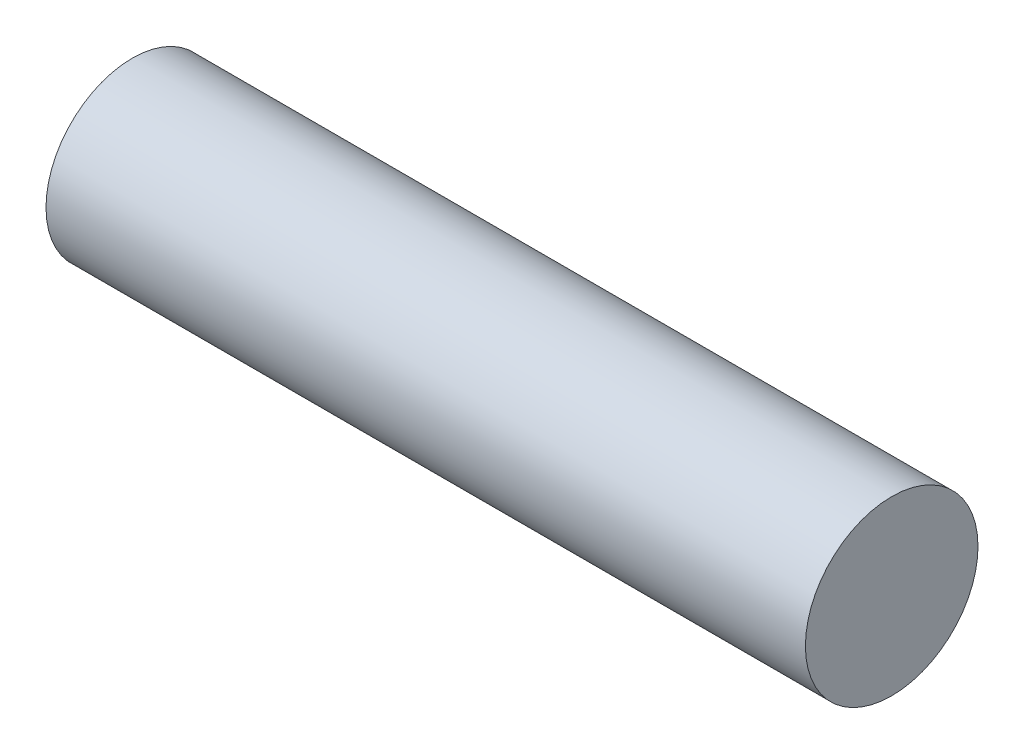
ISO-10303-21;
HEADER;
FILE_DESCRIPTION(('STEP AP214'),'2;1');
FILE_NAME('part.step','',(''),(''),'','','');
FILE_SCHEMA(('AUTOMOTIVE_DESIGN { 1 0 10303 214 1 1 1 1 }'));
ENDSEC;
DATA;
#1=APPLICATION_CONTEXT('core data for automotive mechanical design processes');
#2=APPLICATION_PROTOCOL_DEFINITION('international standard','automotive_design',2000,#1);
#3=PRODUCT_CONTEXT('',#1,'mechanical');
#4=PRODUCT('Part','Part','',(#3));
#5=PRODUCT_RELATED_PRODUCT_CATEGORY('part','',(#4));
#6=PRODUCT_DEFINITION_FORMATION('','',#4);
#7=PRODUCT_DEFINITION_CONTEXT('part definition',#1,'design');
#8=PRODUCT_DEFINITION('design','',#6,#7);
#9=PRODUCT_DEFINITION_SHAPE('','',#8);
#10=(LENGTH_UNIT() NAMED_UNIT(*) SI_UNIT(.MILLI.,.METRE.));
#11=(NAMED_UNIT(*) PLANE_ANGLE_UNIT() SI_UNIT($,.RADIAN.));
#12=(NAMED_UNIT(*) SI_UNIT($,.STERADIAN.) SOLID_ANGLE_UNIT());
#13=UNCERTAINTY_MEASURE_WITH_UNIT(LENGTH_MEASURE(1.E-05),#10,'distance_accuracy_value','');
#14=(GEOMETRIC_REPRESENTATION_CONTEXT(3) GLOBAL_UNCERTAINTY_ASSIGNED_CONTEXT((#13)) GLOBAL_UNIT_ASSIGNED_CONTEXT((#10,
#11,#12)) REPRESENTATION_CONTEXT('',''));
#15=CARTESIAN_POINT('',(0.,0.,0.));
#16=DIRECTION('',(0.,0.,1.));
#17=DIRECTION('',(1.,0.,0.));
#18=AXIS2_PLACEMENT_3D('',#15,#16,#17);
#19=CARTESIAN_POINT('',(44.,0.,0.));
#20=DIRECTION('',(-1.,0.,0.));
#21=DIRECTION('',(0.,0.,1.));
#22=AXIS2_PLACEMENT_3D('',#19,#20,#21);
#23=CYLINDRICAL_SURFACE('',#22,5.);
#24=CARTESIAN_POINT('',(44.,0.,0.));
#25=DIRECTION('',(1.,0.,0.));
#26=DIRECTION('',(0.,0.,-1.));
#27=AXIS2_PLACEMENT_3D('',#24,#25,#26);
#28=CIRCLE('',#27,5.);
#29=CARTESIAN_POINT('',(44.,0.,-5.));
#30=VERTEX_POINT('',#29);
#31=EDGE_CURVE('E10',#30,#30,#28,.T.);
#32=ORIENTED_EDGE('',*,*,#31,.F.);
#33=EDGE_LOOP('',(#32));
#34=FACE_BOUND('',#33,.T.);
#35=CARTESIAN_POINT('',(0.,0.,0.));
#36=DIRECTION('',(1.,0.,0.));
#37=DIRECTION('',(0.,0.,-1.));
#38=AXIS2_PLACEMENT_3D('',#35,#36,#37);
#39=CIRCLE('',#38,5.);
#40=CARTESIAN_POINT('',(0.,0.,-5.));
#41=VERTEX_POINT('',#40);
#42=EDGE_CURVE('E34',#41,#41,#39,.T.);
#43=ORIENTED_EDGE('',*,*,#42,.T.);
#44=EDGE_LOOP('',(#43));
#45=FACE_BOUND('',#44,.T.);
#46=ADVANCED_FACE('F31',(#34,#45),#23,.T.);
#47=CARTESIAN_POINT('',(44.,0.,0.));
#48=DIRECTION('',(1.,0.,0.));
#49=DIRECTION('',(0.,0.,-1.));
#50=AXIS2_PLACEMENT_3D('',#47,#48,#49);
#51=PLANE('',#50);
#52=ORIENTED_EDGE('',*,*,#31,.T.);
#53=EDGE_LOOP('',(#52));
#54=FACE_BOUND('',#53,.T.);
#55=ADVANCED_FACE('F46',(#54),#51,.T.);
#56=CARTESIAN_POINT('',(0.,0.,0.));
#57=DIRECTION('',(1.,0.,0.));
#58=DIRECTION('',(0.,0.,-1.));
#59=AXIS2_PLACEMENT_3D('',#56,#57,#58);
#60=PLANE('',#59);
#61=ORIENTED_EDGE('',*,*,#42,.F.);
#62=EDGE_LOOP('',(#61));
#63=FACE_BOUND('',#62,.T.);
#64=ADVANCED_FACE('F44',(#63),#60,.F.);
#65=CLOSED_SHELL('',(#46,#55,#64));
#66=MANIFOLD_SOLID_BREP('B2',#65);
#67=ADVANCED_BREP_SHAPE_REPRESENTATION('',(#18,#66),#14);
#68=SHAPE_DEFINITION_REPRESENTATION(#9,#67);
ENDSEC;
END-ISO-10303-21;
